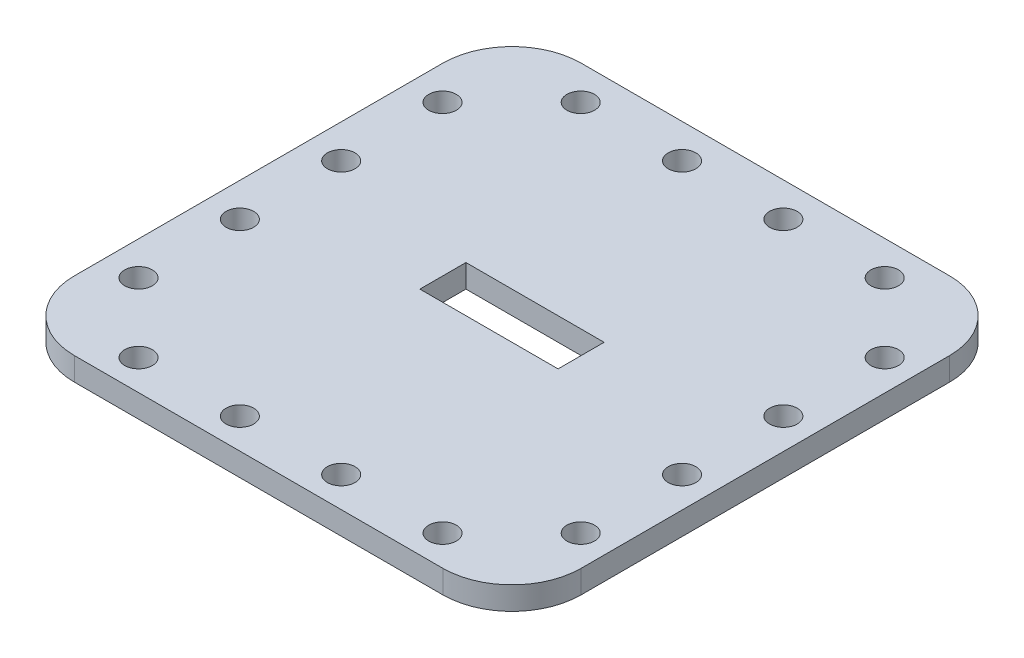
ISO-10303-21;
HEADER;
FILE_DESCRIPTION(('STEP AP214'),'2;1');
FILE_NAME('part.step','',(''),(''),'','','');
FILE_SCHEMA(('AUTOMOTIVE_DESIGN { 1 0 10303 214 1 1 1 1 }'));
ENDSEC;
DATA;
#1=APPLICATION_CONTEXT('core data for automotive mechanical design processes');
#2=APPLICATION_PROTOCOL_DEFINITION('international standard','automotive_design',2000,#1);
#3=PRODUCT_CONTEXT('',#1,'mechanical');
#4=PRODUCT('Part','Part','',(#3));
#5=PRODUCT_RELATED_PRODUCT_CATEGORY('part','',(#4));
#6=PRODUCT_DEFINITION_FORMATION('','',#4);
#7=PRODUCT_DEFINITION_CONTEXT('part definition',#1,'design');
#8=PRODUCT_DEFINITION('design','',#6,#7);
#9=PRODUCT_DEFINITION_SHAPE('','',#8);
#10=(LENGTH_UNIT() NAMED_UNIT(*) SI_UNIT(.MILLI.,.METRE.));
#11=(NAMED_UNIT(*) PLANE_ANGLE_UNIT() SI_UNIT($,.RADIAN.));
#12=(NAMED_UNIT(*) SI_UNIT($,.STERADIAN.) SOLID_ANGLE_UNIT());
#13=UNCERTAINTY_MEASURE_WITH_UNIT(LENGTH_MEASURE(1.E-05),#10,'distance_accuracy_value','');
#14=(GEOMETRIC_REPRESENTATION_CONTEXT(3) GLOBAL_UNCERTAINTY_ASSIGNED_CONTEXT((#13)) GLOBAL_UNIT_ASSIGNED_CONTEXT((#10,
#11,#12)) REPRESENTATION_CONTEXT('',''));
#15=CARTESIAN_POINT('',(0.,0.,0.));
#16=DIRECTION('',(0.,0.,1.));
#17=DIRECTION('',(1.,0.,0.));
#18=AXIS2_PLACEMENT_3D('',#15,#16,#17);
#19=CARTESIAN_POINT('',(40.,5.,55.));
#20=DIRECTION('',(0.,1.,0.));
#21=DIRECTION('',(0.,0.,1.));
#22=AXIS2_PLACEMENT_3D('',#19,#20,#21);
#23=PLANE('',#22);
#24=DIRECTION('',(0.,0.,-1.));
#25=VECTOR('',#24,1.);
#26=CARTESIAN_POINT('',(15.,5.,5.));
#27=LINE('',#26,#25);
#28=CARTESIAN_POINT('',(15.,5.,5.));
#29=VERTEX_POINT('',#28);
#30=CARTESIAN_POINT('',(15.,5.,-5.));
#31=VERTEX_POINT('',#30);
#32=EDGE_CURVE('E56',#29,#31,#27,.T.);
#33=ORIENTED_EDGE('',*,*,#32,.F.);
#34=DIRECTION('',(1.,0.,0.));
#35=VECTOR('',#34,1.);
#36=CARTESIAN_POINT('',(-15.,5.,5.));
#37=LINE('',#36,#35);
#38=CARTESIAN_POINT('',(-15.,5.,5.));
#39=VERTEX_POINT('',#38);
#40=EDGE_CURVE('E147',#39,#29,#37,.T.);
#41=ORIENTED_EDGE('',*,*,#40,.F.);
#42=DIRECTION('',(0.,0.,1.));
#43=VECTOR('',#42,1.);
#44=CARTESIAN_POINT('',(-15.,5.,5.));
#45=LINE('',#44,#43);
#46=CARTESIAN_POINT('',(-15.,5.,-5.));
#47=VERTEX_POINT('',#46);
#48=EDGE_CURVE('E132',#47,#39,#45,.T.);
#49=ORIENTED_EDGE('',*,*,#48,.F.);
#50=DIRECTION('',(-1.,0.,0.));
#51=VECTOR('',#50,1.);
#52=CARTESIAN_POINT('',(-15.,5.,-5.));
#53=LINE('',#52,#51);
#54=EDGE_CURVE('E141',#31,#47,#53,.T.);
#55=ORIENTED_EDGE('',*,*,#54,.F.);
#56=EDGE_LOOP('',(#33,#41,#49,#55));
#57=FACE_BOUND('',#56,.T.);
#58=CARTESIAN_POINT('',(48.3346963055934,5.,-10.5816296180082));
#59=DIRECTION('',(0.,-1.,0.));
#60=DIRECTION('',(0.,0.,-1.));
#61=AXIS2_PLACEMENT_3D('',#58,#59,#60);
#62=CIRCLE('',#61,3.00000000000002);
#63=CARTESIAN_POINT('',(48.3346963055934,5.,-13.5816296180082));
#64=VERTEX_POINT('',#63);
#65=EDGE_CURVE('E210',#64,#64,#62,.T.);
#66=ORIENTED_EDGE('',*,*,#65,.T.);
#67=EDGE_LOOP('',(#66));
#68=FACE_BOUND('',#67,.T.);
#69=CARTESIAN_POINT('',(-32.6653036944065,5.,-47.5816296180083));
#70=DIRECTION('',(0.,-1.,0.));
#71=DIRECTION('',(0.,0.,-1.));
#72=AXIS2_PLACEMENT_3D('',#69,#70,#71);
#73=CIRCLE('',#72,3.00000000000001);
#74=CARTESIAN_POINT('',(-32.6653036944065,5.,-50.5816296180083));
#75=VERTEX_POINT('',#74);
#76=EDGE_CURVE('E222',#75,#75,#73,.T.);
#77=ORIENTED_EDGE('',*,*,#76,.T.);
#78=EDGE_LOOP('',(#77));
#79=FACE_BOUND('',#78,.T.);
#80=CARTESIAN_POINT('',(-47.6653036944066,5.,-32.5816296180082));
#81=DIRECTION('',(0.,-1.,0.));
#82=DIRECTION('',(0.,0.,-1.));
#83=AXIS2_PLACEMENT_3D('',#80,#81,#82);
#84=CIRCLE('',#83,3.);
#85=CARTESIAN_POINT('',(-47.6653036944066,5.,-35.5816296180082));
#86=VERTEX_POINT('',#85);
#87=EDGE_CURVE('E225',#86,#86,#84,.T.);
#88=ORIENTED_EDGE('',*,*,#87,.T.);
#89=EDGE_LOOP('',(#88));
#90=FACE_BOUND('',#89,.T.);
#91=CARTESIAN_POINT('',(-47.6653036944066,5.,-10.5816296180082));
#92=DIRECTION('',(0.,-1.,0.));
#93=DIRECTION('',(0.,0.,-1.));
#94=AXIS2_PLACEMENT_3D('',#91,#92,#93);
#95=CIRCLE('',#94,3.00000000000003);
#96=CARTESIAN_POINT('',(-47.6653036944066,5.,-13.5816296180083));
#97=VERTEX_POINT('',#96);
#98=EDGE_CURVE('E228',#97,#97,#95,.T.);
#99=ORIENTED_EDGE('',*,*,#98,.T.);
#100=EDGE_LOOP('',(#99));
#101=FACE_BOUND('',#100,.T.);
#102=CARTESIAN_POINT('',(-47.6653036944066,5.,11.4183703819918));
#103=DIRECTION('',(0.,-1.,0.));
#104=DIRECTION('',(0.,0.,-1.));
#105=AXIS2_PLACEMENT_3D('',#102,#103,#104);
#106=CIRCLE('',#105,2.99999999999997);
#107=CARTESIAN_POINT('',(-47.6653036944066,5.,8.4183703819918));
#108=VERTEX_POINT('',#107);
#109=EDGE_CURVE('E231',#108,#108,#106,.T.);
#110=ORIENTED_EDGE('',*,*,#109,.T.);
#111=EDGE_LOOP('',(#110));
#112=FACE_BOUND('',#111,.T.);
#113=CARTESIAN_POINT('',(-10.6653036944066,5.,48.4183703819918));
#114=DIRECTION('',(0.,-1.,0.));
#115=DIRECTION('',(0.,0.,-1.));
#116=AXIS2_PLACEMENT_3D('',#113,#114,#115);
#117=CIRCLE('',#116,3.00000000000002);
#118=CARTESIAN_POINT('',(-10.6653036944066,5.,45.4183703819917));
#119=VERTEX_POINT('',#118);
#120=EDGE_CURVE('E234',#119,#119,#117,.T.);
#121=ORIENTED_EDGE('',*,*,#120,.T.);
#122=EDGE_LOOP('',(#121));
#123=FACE_BOUND('',#122,.T.);
#124=CARTESIAN_POINT('',(11.3346963055934,5.,48.4183703819918));
#125=DIRECTION('',(0.,-1.,0.));
#126=DIRECTION('',(0.,0.,-1.));
#127=AXIS2_PLACEMENT_3D('',#124,#125,#126);
#128=CIRCLE('',#127,2.99999999999997);
#129=CARTESIAN_POINT('',(11.3346963055934,5.,45.4183703819918));
#130=VERTEX_POINT('',#129);
#131=EDGE_CURVE('E237',#130,#130,#128,.T.);
#132=ORIENTED_EDGE('',*,*,#131,.T.);
#133=EDGE_LOOP('',(#132));
#134=FACE_BOUND('',#133,.T.);
#135=CARTESIAN_POINT('',(33.3346963055934,5.,48.4183703819918));
#136=DIRECTION('',(0.,-1.,0.));
#137=DIRECTION('',(0.,0.,-1.));
#138=AXIS2_PLACEMENT_3D('',#135,#136,#137);
#139=CIRCLE('',#138,3.00000000000001);
#140=CARTESIAN_POINT('',(33.3346963055934,5.,45.4183703819917));
#141=VERTEX_POINT('',#140);
#142=EDGE_CURVE('E240',#141,#141,#139,.T.);
#143=ORIENTED_EDGE('',*,*,#142,.T.);
#144=EDGE_LOOP('',(#143));
#145=FACE_BOUND('',#144,.T.);
#146=CARTESIAN_POINT('',(48.3346963055934,5.,11.4183703819918));
#147=DIRECTION('',(0.,-1.,0.));
#148=DIRECTION('',(0.,0.,-1.));
#149=AXIS2_PLACEMENT_3D('',#146,#147,#148);
#150=CIRCLE('',#149,2.99999999999997);
#151=CARTESIAN_POINT('',(48.3346963055934,5.,8.4183703819918));
#152=VERTEX_POINT('',#151);
#153=EDGE_CURVE('E243',#152,#152,#150,.T.);
#154=ORIENTED_EDGE('',*,*,#153,.T.);
#155=EDGE_LOOP('',(#154));
#156=FACE_BOUND('',#155,.T.);
#157=CARTESIAN_POINT('',(48.3346963055935,5.,-32.5816296180082));
#158=DIRECTION('',(0.,-1.,0.));
#159=DIRECTION('',(0.,0.,-1.));
#160=AXIS2_PLACEMENT_3D('',#157,#158,#159);
#161=CIRCLE('',#160,3.00000000000001);
#162=CARTESIAN_POINT('',(48.3346963055935,5.,-35.5816296180082));
#163=VERTEX_POINT('',#162);
#164=EDGE_CURVE('E246',#163,#163,#161,.T.);
#165=ORIENTED_EDGE('',*,*,#164,.T.);
#166=EDGE_LOOP('',(#165));
#167=FACE_BOUND('',#166,.T.);
#168=CARTESIAN_POINT('',(33.3346963055935,5.,-47.5816296180082));
#169=DIRECTION('',(0.,-1.,0.));
#170=DIRECTION('',(0.,0.,-1.));
#171=AXIS2_PLACEMENT_3D('',#168,#169,#170);
#172=CIRCLE('',#171,2.99999999999997);
#173=CARTESIAN_POINT('',(33.3346963055935,5.,-50.5816296180082));
#174=VERTEX_POINT('',#173);
#175=EDGE_CURVE('E249',#174,#174,#172,.T.);
#176=ORIENTED_EDGE('',*,*,#175,.T.);
#177=EDGE_LOOP('',(#176));
#178=FACE_BOUND('',#177,.T.);
#179=CARTESIAN_POINT('',(11.3346963055935,5.,-47.5816296180082));
#180=DIRECTION('',(0.,-1.,0.));
#181=DIRECTION('',(0.,0.,-1.));
#182=AXIS2_PLACEMENT_3D('',#179,#180,#181);
#183=CIRCLE('',#182,2.99999999999997);
#184=CARTESIAN_POINT('',(11.3346963055935,5.,-50.5816296180082));
#185=VERTEX_POINT('',#184);
#186=EDGE_CURVE('E252',#185,#185,#183,.T.);
#187=ORIENTED_EDGE('',*,*,#186,.T.);
#188=EDGE_LOOP('',(#187));
#189=FACE_BOUND('',#188,.T.);
#190=CARTESIAN_POINT('',(-10.6653036944065,5.,-47.5816296180082));
#191=DIRECTION('',(0.,-1.,0.));
#192=DIRECTION('',(0.,0.,-1.));
#193=AXIS2_PLACEMENT_3D('',#190,#191,#192);
#194=CIRCLE('',#193,3.00000000000002);
#195=CARTESIAN_POINT('',(-10.6653036944065,5.,-50.5816296180083));
#196=VERTEX_POINT('',#195);
#197=EDGE_CURVE('E255',#196,#196,#194,.T.);
#198=ORIENTED_EDGE('',*,*,#197,.T.);
#199=EDGE_LOOP('',(#198));
#200=FACE_BOUND('',#199,.T.);
#201=CARTESIAN_POINT('',(-47.6653036944065,5.,33.4183703819918));
#202=DIRECTION('',(0.,-1.,0.));
#203=DIRECTION('',(0.,0.,-1.));
#204=AXIS2_PLACEMENT_3D('',#201,#202,#203);
#205=CIRCLE('',#204,3.);
#206=CARTESIAN_POINT('',(-47.6653036944065,5.,30.4183703819918));
#207=VERTEX_POINT('',#206);
#208=EDGE_CURVE('E258',#207,#207,#205,.T.);
#209=ORIENTED_EDGE('',*,*,#208,.T.);
#210=EDGE_LOOP('',(#209));
#211=FACE_BOUND('',#210,.T.);
#212=CARTESIAN_POINT('',(-32.6653036944065,5.,48.4183703819918));
#213=DIRECTION('',(0.,-1.,0.));
#214=DIRECTION('',(0.,0.,-1.));
#215=AXIS2_PLACEMENT_3D('',#212,#213,#214);
#216=CIRCLE('',#215,3.00000000000001);
#217=CARTESIAN_POINT('',(-32.6653036944065,5.,45.4183703819918));
#218=VERTEX_POINT('',#217);
#219=EDGE_CURVE('E261',#218,#218,#216,.T.);
#220=ORIENTED_EDGE('',*,*,#219,.T.);
#221=EDGE_LOOP('',(#220));
#222=FACE_BOUND('',#221,.T.);
#223=CARTESIAN_POINT('',(48.3346963055934,5.,33.4183703819918));
#224=DIRECTION('',(0.,-1.,0.));
#225=DIRECTION('',(0.,0.,-1.));
#226=AXIS2_PLACEMENT_3D('',#223,#224,#225);
#227=CIRCLE('',#226,3.00000000000001);
#228=CARTESIAN_POINT('',(48.3346963055934,5.,30.4183703819918));
#229=VERTEX_POINT('',#228);
#230=EDGE_CURVE('E264',#229,#229,#227,.T.);
#231=ORIENTED_EDGE('',*,*,#230,.T.);
#232=EDGE_LOOP('',(#231));
#233=FACE_BOUND('',#232,.T.);
#234=DIRECTION('',(1.,0.,0.));
#235=VECTOR('',#234,1.);
#236=CARTESIAN_POINT('',(-55.,5.,55.));
#237=LINE('',#236,#235);
#238=CARTESIAN_POINT('',(-40.,5.,55.));
#239=VERTEX_POINT('',#238);
#240=CARTESIAN_POINT('',(40.,5.,55.));
#241=VERTEX_POINT('',#240);
#242=EDGE_CURVE('E197',#239,#241,#237,.T.);
#243=ORIENTED_EDGE('',*,*,#242,.T.);
#244=CARTESIAN_POINT('',(40.,5.,40.));
#245=DIRECTION('',(0.,-1.,0.));
#246=DIRECTION('',(0.,0.,-1.));
#247=AXIS2_PLACEMENT_3D('',#244,#245,#246);
#248=CIRCLE('',#247,15.);
#249=CARTESIAN_POINT('',(55.,5.,40.));
#250=VERTEX_POINT('',#249);
#251=EDGE_CURVE('E154',#241,#250,#248,.F.);
#252=ORIENTED_EDGE('',*,*,#251,.T.);
#253=DIRECTION('',(0.,0.,-1.));
#254=VECTOR('',#253,1.);
#255=CARTESIAN_POINT('',(55.,5.,55.));
#256=LINE('',#255,#254);
#257=CARTESIAN_POINT('',(55.,5.,-40.));
#258=VERTEX_POINT('',#257);
#259=EDGE_CURVE('E202',#250,#258,#256,.T.);
#260=ORIENTED_EDGE('',*,*,#259,.T.);
#261=CARTESIAN_POINT('',(40.,5.,-40.));
#262=DIRECTION('',(0.,-1.,0.));
#263=DIRECTION('',(0.,0.,-1.));
#264=AXIS2_PLACEMENT_3D('',#261,#262,#263);
#265=CIRCLE('',#264,15.);
#266=CARTESIAN_POINT('',(40.,5.,-55.));
#267=VERTEX_POINT('',#266);
#268=EDGE_CURVE('E186',#258,#267,#265,.F.);
#269=ORIENTED_EDGE('',*,*,#268,.T.);
#270=DIRECTION('',(-1.,0.,0.));
#271=VECTOR('',#270,1.);
#272=CARTESIAN_POINT('',(-55.,5.,-55.));
#273=LINE('',#272,#271);
#274=CARTESIAN_POINT('',(-40.,5.,-55.));
#275=VERTEX_POINT('',#274);
#276=EDGE_CURVE('E216',#267,#275,#273,.T.);
#277=ORIENTED_EDGE('',*,*,#276,.T.);
#278=CARTESIAN_POINT('',(-40.,5.,-40.));
#279=DIRECTION('',(0.,-1.,0.));
#280=DIRECTION('',(0.,0.,-1.));
#281=AXIS2_PLACEMENT_3D('',#278,#279,#280);
#282=CIRCLE('',#281,15.);
#283=CARTESIAN_POINT('',(-55.,5.,-40.));
#284=VERTEX_POINT('',#283);
#285=EDGE_CURVE('E176',#275,#284,#282,.F.);
#286=ORIENTED_EDGE('',*,*,#285,.T.);
#287=DIRECTION('',(0.,0.,1.));
#288=VECTOR('',#287,1.);
#289=CARTESIAN_POINT('',(-55.,5.,55.));
#290=LINE('',#289,#288);
#291=CARTESIAN_POINT('',(-55.,5.,40.));
#292=VERTEX_POINT('',#291);
#293=EDGE_CURVE('E213',#284,#292,#290,.T.);
#294=ORIENTED_EDGE('',*,*,#293,.T.);
#295=CARTESIAN_POINT('',(-40.,5.,40.));
#296=DIRECTION('',(0.,-1.,0.));
#297=DIRECTION('',(0.,0.,-1.));
#298=AXIS2_PLACEMENT_3D('',#295,#296,#297);
#299=CIRCLE('',#298,15.);
#300=EDGE_CURVE('E166',#292,#239,#299,.F.);
#301=ORIENTED_EDGE('',*,*,#300,.T.);
#302=EDGE_LOOP('',(#243,#252,#260,#269,#277,#286,#294,#301));
#303=FACE_BOUND('',#302,.T.);
#304=ADVANCED_FACE('F42',(#57,#68,#79,#90,#101,#112,#123,#134,#145,#156,#167,#178,#189,#200,
#211,#222,#233,#303),#23,.T.);
#305=CARTESIAN_POINT('',(40.,5.,-40.));
#306=DIRECTION('',(0.,1.,0.));
#307=DIRECTION('',(0.,0.,1.));
#308=AXIS2_PLACEMENT_3D('',#305,#306,#307);
#309=CYLINDRICAL_SURFACE('',#308,15.);
#310=DIRECTION('',(0.,1.,0.));
#311=VECTOR('',#310,1.);
#312=CARTESIAN_POINT('',(55.,5.,-40.));
#313=LINE('',#312,#311);
#314=CARTESIAN_POINT('',(55.,0.,-40.));
#315=VERTEX_POINT('',#314);
#316=EDGE_CURVE('E194',#315,#258,#313,.T.);
#317=ORIENTED_EDGE('',*,*,#316,.F.);
#318=CARTESIAN_POINT('',(40.,0.,-40.));
#319=DIRECTION('',(0.,-1.,0.));
#320=DIRECTION('',(0.,0.,-1.));
#321=AXIS2_PLACEMENT_3D('',#318,#319,#320);
#322=CIRCLE('',#321,15.);
#323=CARTESIAN_POINT('',(40.,0.,-55.));
#324=VERTEX_POINT('',#323);
#325=EDGE_CURVE('E188',#324,#315,#322,.T.);
#326=ORIENTED_EDGE('',*,*,#325,.F.);
#327=DIRECTION('',(0.,1.,0.));
#328=VECTOR('',#327,1.);
#329=CARTESIAN_POINT('',(40.,5.,-55.));
#330=LINE('',#329,#328);
#331=EDGE_CURVE('E191',#267,#324,#330,.F.);
#332=ORIENTED_EDGE('',*,*,#331,.F.);
#333=ORIENTED_EDGE('',*,*,#268,.F.);
#334=EDGE_LOOP('',(#317,#326,#332,#333));
#335=FACE_BOUND('',#334,.T.);
#336=ADVANCED_FACE('F340',(#335),#309,.T.);
#337=CARTESIAN_POINT('',(-40.,5.,-40.));
#338=DIRECTION('',(0.,1.,0.));
#339=DIRECTION('',(0.,0.,1.));
#340=AXIS2_PLACEMENT_3D('',#337,#338,#339);
#341=CYLINDRICAL_SURFACE('',#340,15.);
#342=DIRECTION('',(0.,1.,0.));
#343=VECTOR('',#342,1.);
#344=CARTESIAN_POINT('',(-40.,5.,-55.));
#345=LINE('',#344,#343);
#346=CARTESIAN_POINT('',(-40.,0.,-55.));
#347=VERTEX_POINT('',#346);
#348=EDGE_CURVE('E183',#347,#275,#345,.T.);
#349=ORIENTED_EDGE('',*,*,#348,.F.);
#350=CARTESIAN_POINT('',(-40.,0.,-40.));
#351=DIRECTION('',(0.,-1.,0.));
#352=DIRECTION('',(0.,0.,-1.));
#353=AXIS2_PLACEMENT_3D('',#350,#351,#352);
#354=CIRCLE('',#353,15.);
#355=CARTESIAN_POINT('',(-55.,0.,-40.));
#356=VERTEX_POINT('',#355);
#357=EDGE_CURVE('E178',#356,#347,#354,.T.);
#358=ORIENTED_EDGE('',*,*,#357,.F.);
#359=DIRECTION('',(0.,1.,0.));
#360=VECTOR('',#359,1.);
#361=CARTESIAN_POINT('',(-55.,5.,-40.));
#362=LINE('',#361,#360);
#363=EDGE_CURVE('E180',#284,#356,#362,.F.);
#364=ORIENTED_EDGE('',*,*,#363,.F.);
#365=ORIENTED_EDGE('',*,*,#285,.F.);
#366=EDGE_LOOP('',(#349,#358,#364,#365));
#367=FACE_BOUND('',#366,.T.);
#368=ADVANCED_FACE('F342',(#367),#341,.T.);
#369=CARTESIAN_POINT('',(-40.,5.,40.));
#370=DIRECTION('',(0.,1.,0.));
#371=DIRECTION('',(0.,0.,1.));
#372=AXIS2_PLACEMENT_3D('',#369,#370,#371);
#373=CYLINDRICAL_SURFACE('',#372,15.);
#374=DIRECTION('',(0.,1.,0.));
#375=VECTOR('',#374,1.);
#376=CARTESIAN_POINT('',(-55.,5.,40.));
#377=LINE('',#376,#375);
#378=CARTESIAN_POINT('',(-55.,0.,40.));
#379=VERTEX_POINT('',#378);
#380=EDGE_CURVE('E173',#379,#292,#377,.T.);
#381=ORIENTED_EDGE('',*,*,#380,.F.);
#382=CARTESIAN_POINT('',(-40.,0.,40.));
#383=DIRECTION('',(0.,-1.,0.));
#384=DIRECTION('',(0.,0.,-1.));
#385=AXIS2_PLACEMENT_3D('',#382,#383,#384);
#386=CIRCLE('',#385,15.);
#387=CARTESIAN_POINT('',(-40.,0.,55.));
#388=VERTEX_POINT('',#387);
#389=EDGE_CURVE('E168',#388,#379,#386,.T.);
#390=ORIENTED_EDGE('',*,*,#389,.F.);
#391=DIRECTION('',(0.,1.,0.));
#392=VECTOR('',#391,1.);
#393=CARTESIAN_POINT('',(-40.,5.,55.));
#394=LINE('',#393,#392);
#395=EDGE_CURVE('E170',#239,#388,#394,.F.);
#396=ORIENTED_EDGE('',*,*,#395,.F.);
#397=ORIENTED_EDGE('',*,*,#300,.F.);
#398=EDGE_LOOP('',(#381,#390,#396,#397));
#399=FACE_BOUND('',#398,.T.);
#400=ADVANCED_FACE('F348',(#399),#373,.T.);
#401=CARTESIAN_POINT('',(40.,5.,40.));
#402=DIRECTION('',(0.,1.,0.));
#403=DIRECTION('',(0.,0.,1.));
#404=AXIS2_PLACEMENT_3D('',#401,#402,#403);
#405=CYLINDRICAL_SURFACE('',#404,15.);
#406=DIRECTION('',(0.,1.,0.));
#407=VECTOR('',#406,1.);
#408=CARTESIAN_POINT('',(40.,5.,55.));
#409=LINE('',#408,#407);
#410=CARTESIAN_POINT('',(40.,0.,55.));
#411=VERTEX_POINT('',#410);
#412=EDGE_CURVE('E163',#411,#241,#409,.T.);
#413=ORIENTED_EDGE('',*,*,#412,.F.);
#414=CARTESIAN_POINT('',(40.,0.,40.));
#415=DIRECTION('',(0.,-1.,0.));
#416=DIRECTION('',(0.,0.,-1.));
#417=AXIS2_PLACEMENT_3D('',#414,#415,#416);
#418=CIRCLE('',#417,15.);
#419=CARTESIAN_POINT('',(55.,0.,40.));
#420=VERTEX_POINT('',#419);
#421=EDGE_CURVE('E158',#420,#411,#418,.T.);
#422=ORIENTED_EDGE('',*,*,#421,.F.);
#423=DIRECTION('',(0.,1.,0.));
#424=VECTOR('',#423,1.);
#425=CARTESIAN_POINT('',(55.,5.,40.));
#426=LINE('',#425,#424);
#427=EDGE_CURVE('E160',#250,#420,#426,.F.);
#428=ORIENTED_EDGE('',*,*,#427,.F.);
#429=ORIENTED_EDGE('',*,*,#251,.F.);
#430=EDGE_LOOP('',(#413,#422,#428,#429));
#431=FACE_BOUND('',#430,.T.);
#432=ADVANCED_FACE('F369',(#431),#405,.T.);
#433=CARTESIAN_POINT('',(0.,0.,0.));
#434=DIRECTION('',(0.,-1.,0.));
#435=DIRECTION('',(0.,0.,-1.));
#436=AXIS2_PLACEMENT_3D('',#433,#434,#435);
#437=PLANE('',#436);
#438=DIRECTION('',(0.,0.,1.));
#439=VECTOR('',#438,1.);
#440=CARTESIAN_POINT('',(15.,0.,0.));
#441=LINE('',#440,#439);
#442=CARTESIAN_POINT('',(15.,0.,-5.));
#443=VERTEX_POINT('',#442);
#444=CARTESIAN_POINT('',(15.,0.,5.));
#445=VERTEX_POINT('',#444);
#446=EDGE_CURVE('E11',#443,#445,#441,.T.);
#447=ORIENTED_EDGE('',*,*,#446,.F.);
#448=DIRECTION('',(1.,0.,0.));
#449=VECTOR('',#448,1.);
#450=CARTESIAN_POINT('',(0.,0.,-5.));
#451=LINE('',#450,#449);
#452=CARTESIAN_POINT('',(-15.,0.,-5.));
#453=VERTEX_POINT('',#452);
#454=EDGE_CURVE('E298',#453,#443,#451,.T.);
#455=ORIENTED_EDGE('',*,*,#454,.F.);
#456=DIRECTION('',(0.,0.,-1.));
#457=VECTOR('',#456,1.);
#458=CARTESIAN_POINT('',(-15.,0.,0.));
#459=LINE('',#458,#457);
#460=CARTESIAN_POINT('',(-15.,0.,5.));
#461=VERTEX_POINT('',#460);
#462=EDGE_CURVE('E135',#461,#453,#459,.T.);
#463=ORIENTED_EDGE('',*,*,#462,.F.);
#464=DIRECTION('',(-1.,0.,0.));
#465=VECTOR('',#464,1.);
#466=CARTESIAN_POINT('',(0.,0.,5.));
#467=LINE('',#466,#465);
#468=EDGE_CURVE('E49',#445,#461,#467,.T.);
#469=ORIENTED_EDGE('',*,*,#468,.F.);
#470=EDGE_LOOP('',(#447,#455,#463,#469));
#471=FACE_BOUND('',#470,.T.);
#472=CARTESIAN_POINT('',(48.3346963055934,0.,-10.5816296180082));
#473=DIRECTION('',(0.,-1.,0.));
#474=DIRECTION('',(0.,0.,-1.));
#475=AXIS2_PLACEMENT_3D('',#472,#473,#474);
#476=CIRCLE('',#475,3.00000000000002);
#477=CARTESIAN_POINT('',(48.3346963055934,0.,-13.5816296180082));
#478=VERTEX_POINT('',#477);
#479=EDGE_CURVE('E270',#478,#478,#476,.T.);
#480=ORIENTED_EDGE('',*,*,#479,.F.);
#481=EDGE_LOOP('',(#480));
#482=FACE_BOUND('',#481,.T.);
#483=CARTESIAN_POINT('',(-32.6653036944065,0.,-47.5816296180083));
#484=DIRECTION('',(0.,-1.,0.));
#485=DIRECTION('',(0.,0.,-1.));
#486=AXIS2_PLACEMENT_3D('',#483,#484,#485);
#487=CIRCLE('',#486,3.00000000000001);
#488=CARTESIAN_POINT('',(-32.6653036944065,0.,-50.5816296180083));
#489=VERTEX_POINT('',#488);
#490=EDGE_CURVE('E290',#489,#489,#487,.T.);
#491=ORIENTED_EDGE('',*,*,#490,.F.);
#492=EDGE_LOOP('',(#491));
#493=FACE_BOUND('',#492,.T.);
#494=CARTESIAN_POINT('',(-47.6653036944066,0.,-32.5816296180082));
#495=DIRECTION('',(0.,-1.,0.));
#496=DIRECTION('',(0.,0.,-1.));
#497=AXIS2_PLACEMENT_3D('',#494,#495,#496);
#498=CIRCLE('',#497,3.);
#499=CARTESIAN_POINT('',(-47.6653036944066,0.,-35.5816296180082));
#500=VERTEX_POINT('',#499);
#501=EDGE_CURVE('E287',#500,#500,#498,.T.);
#502=ORIENTED_EDGE('',*,*,#501,.F.);
#503=EDGE_LOOP('',(#502));
#504=FACE_BOUND('',#503,.T.);
#505=CARTESIAN_POINT('',(-47.6653036944066,0.,-10.5816296180082));
#506=DIRECTION('',(0.,-1.,0.));
#507=DIRECTION('',(0.,0.,-1.));
#508=AXIS2_PLACEMENT_3D('',#505,#506,#507);
#509=CIRCLE('',#508,3.00000000000003);
#510=CARTESIAN_POINT('',(-47.6653036944066,0.,-13.5816296180083));
#511=VERTEX_POINT('',#510);
#512=EDGE_CURVE('E284',#511,#511,#509,.T.);
#513=ORIENTED_EDGE('',*,*,#512,.F.);
#514=EDGE_LOOP('',(#513));
#515=FACE_BOUND('',#514,.T.);
#516=CARTESIAN_POINT('',(-47.6653036944066,0.,11.4183703819918));
#517=DIRECTION('',(0.,-1.,0.));
#518=DIRECTION('',(0.,0.,-1.));
#519=AXIS2_PLACEMENT_3D('',#516,#517,#518);
#520=CIRCLE('',#519,2.99999999999997);
#521=CARTESIAN_POINT('',(-47.6653036944066,0.,8.4183703819918));
#522=VERTEX_POINT('',#521);
#523=EDGE_CURVE('E281',#522,#522,#520,.T.);
#524=ORIENTED_EDGE('',*,*,#523,.F.);
#525=EDGE_LOOP('',(#524));
#526=FACE_BOUND('',#525,.T.);
#527=CARTESIAN_POINT('',(-10.6653036944066,0.,48.4183703819918));
#528=DIRECTION('',(0.,-1.,0.));
#529=DIRECTION('',(0.,0.,-1.));
#530=AXIS2_PLACEMENT_3D('',#527,#528,#529);
#531=CIRCLE('',#530,3.00000000000002);
#532=CARTESIAN_POINT('',(-10.6653036944066,0.,45.4183703819917));
#533=VERTEX_POINT('',#532);
#534=EDGE_CURVE('E278',#533,#533,#531,.T.);
#535=ORIENTED_EDGE('',*,*,#534,.F.);
#536=EDGE_LOOP('',(#535));
#537=FACE_BOUND('',#536,.T.);
#538=CARTESIAN_POINT('',(11.3346963055934,0.,48.4183703819918));
#539=DIRECTION('',(0.,-1.,0.));
#540=DIRECTION('',(0.,0.,-1.));
#541=AXIS2_PLACEMENT_3D('',#538,#539,#540);
#542=CIRCLE('',#541,2.99999999999997);
#543=CARTESIAN_POINT('',(11.3346963055934,0.,45.4183703819918));
#544=VERTEX_POINT('',#543);
#545=EDGE_CURVE('E275',#544,#544,#542,.T.);
#546=ORIENTED_EDGE('',*,*,#545,.F.);
#547=EDGE_LOOP('',(#546));
#548=FACE_BOUND('',#547,.T.);
#549=CARTESIAN_POINT('',(33.3346963055934,0.,48.4183703819918));
#550=DIRECTION('',(0.,-1.,0.));
#551=DIRECTION('',(0.,0.,-1.));
#552=AXIS2_PLACEMENT_3D('',#549,#550,#551);
#553=CIRCLE('',#552,3.00000000000001);
#554=CARTESIAN_POINT('',(33.3346963055934,0.,45.4183703819917));
#555=VERTEX_POINT('',#554);
#556=EDGE_CURVE('E271',#555,#555,#553,.T.);
#557=ORIENTED_EDGE('',*,*,#556,.F.);
#558=EDGE_LOOP('',(#557));
#559=FACE_BOUND('',#558,.T.);
#560=CARTESIAN_POINT('',(48.3346963055934,0.,11.4183703819918));
#561=DIRECTION('',(0.,-1.,0.));
#562=DIRECTION('',(0.,0.,-1.));
#563=AXIS2_PLACEMENT_3D('',#560,#561,#562);
#564=CIRCLE('',#563,2.99999999999997);
#565=CARTESIAN_POINT('',(48.3346963055934,0.,8.4183703819918));
#566=VERTEX_POINT('',#565);
#567=EDGE_CURVE('E274',#566,#566,#564,.T.);
#568=ORIENTED_EDGE('',*,*,#567,.F.);
#569=EDGE_LOOP('',(#568));
#570=FACE_BOUND('',#569,.T.);
#571=CARTESIAN_POINT('',(48.3346963055935,0.,-32.5816296180082));
#572=DIRECTION('',(0.,-1.,0.));
#573=DIRECTION('',(0.,0.,-1.));
#574=AXIS2_PLACEMENT_3D('',#571,#572,#573);
#575=CIRCLE('',#574,3.00000000000001);
#576=CARTESIAN_POINT('',(48.3346963055935,0.,-35.5816296180082));
#577=VERTEX_POINT('',#576);
#578=EDGE_CURVE('E311',#577,#577,#575,.T.);
#579=ORIENTED_EDGE('',*,*,#578,.F.);
#580=EDGE_LOOP('',(#579));
#581=FACE_BOUND('',#580,.T.);
#582=CARTESIAN_POINT('',(33.3346963055935,0.,-47.5816296180082));
#583=DIRECTION('',(0.,-1.,0.));
#584=DIRECTION('',(0.,0.,-1.));
#585=AXIS2_PLACEMENT_3D('',#582,#583,#584);
#586=CIRCLE('',#585,2.99999999999997);
#587=CARTESIAN_POINT('',(33.3346963055935,0.,-50.5816296180082));
#588=VERTEX_POINT('',#587);
#589=EDGE_CURVE('E308',#588,#588,#586,.T.);
#590=ORIENTED_EDGE('',*,*,#589,.F.);
#591=EDGE_LOOP('',(#590));
#592=FACE_BOUND('',#591,.T.);
#593=CARTESIAN_POINT('',(11.3346963055935,0.,-47.5816296180082));
#594=DIRECTION('',(0.,-1.,0.));
#595=DIRECTION('',(0.,0.,-1.));
#596=AXIS2_PLACEMENT_3D('',#593,#594,#595);
#597=CIRCLE('',#596,2.99999999999997);
#598=CARTESIAN_POINT('',(11.3346963055935,0.,-50.5816296180082));
#599=VERTEX_POINT('',#598);
#600=EDGE_CURVE('E305',#599,#599,#597,.T.);
#601=ORIENTED_EDGE('',*,*,#600,.F.);
#602=EDGE_LOOP('',(#601));
#603=FACE_BOUND('',#602,.T.);
#604=CARTESIAN_POINT('',(-10.6653036944065,0.,-47.5816296180082));
#605=DIRECTION('',(0.,-1.,0.));
#606=DIRECTION('',(0.,0.,-1.));
#607=AXIS2_PLACEMENT_3D('',#604,#605,#606);
#608=CIRCLE('',#607,3.00000000000002);
#609=CARTESIAN_POINT('',(-10.6653036944065,0.,-50.5816296180083));
#610=VERTEX_POINT('',#609);
#611=EDGE_CURVE('E302',#610,#610,#608,.T.);
#612=ORIENTED_EDGE('',*,*,#611,.F.);
#613=EDGE_LOOP('',(#612));
#614=FACE_BOUND('',#613,.T.);
#615=CARTESIAN_POINT('',(-47.6653036944065,0.,33.4183703819918));
#616=DIRECTION('',(0.,-1.,0.));
#617=DIRECTION('',(0.,0.,-1.));
#618=AXIS2_PLACEMENT_3D('',#615,#616,#617);
#619=CIRCLE('',#618,3.);
#620=CARTESIAN_POINT('',(-47.6653036944065,0.,30.4183703819918));
#621=VERTEX_POINT('',#620);
#622=EDGE_CURVE('E299',#621,#621,#619,.T.);
#623=ORIENTED_EDGE('',*,*,#622,.F.);
#624=EDGE_LOOP('',(#623));
#625=FACE_BOUND('',#624,.T.);
#626=CARTESIAN_POINT('',(-32.6653036944065,0.,48.4183703819918));
#627=DIRECTION('',(0.,-1.,0.));
#628=DIRECTION('',(0.,0.,-1.));
#629=AXIS2_PLACEMENT_3D('',#626,#627,#628);
#630=CIRCLE('',#629,3.00000000000001);
#631=CARTESIAN_POINT('',(-32.6653036944065,0.,45.4183703819918));
#632=VERTEX_POINT('',#631);
#633=EDGE_CURVE('E295',#632,#632,#630,.T.);
#634=ORIENTED_EDGE('',*,*,#633,.F.);
#635=EDGE_LOOP('',(#634));
#636=FACE_BOUND('',#635,.T.);
#637=CARTESIAN_POINT('',(48.3346963055934,0.,33.4183703819918));
#638=DIRECTION('',(0.,-1.,0.));
#639=DIRECTION('',(0.,0.,-1.));
#640=AXIS2_PLACEMENT_3D('',#637,#638,#639);
#641=CIRCLE('',#640,3.00000000000001);
#642=CARTESIAN_POINT('',(48.3346963055934,0.,30.4183703819918));
#643=VERTEX_POINT('',#642);
#644=EDGE_CURVE('E267',#643,#643,#641,.T.);
#645=ORIENTED_EDGE('',*,*,#644,.F.);
#646=EDGE_LOOP('',(#645));
#647=FACE_BOUND('',#646,.T.);
#648=DIRECTION('',(0.,0.,-1.));
#649=VECTOR('',#648,1.);
#650=CARTESIAN_POINT('',(55.,0.,55.));
#651=LINE('',#650,#649);
#652=EDGE_CURVE('E208',#420,#315,#651,.T.);
#653=ORIENTED_EDGE('',*,*,#652,.F.);
#654=ORIENTED_EDGE('',*,*,#421,.T.);
#655=DIRECTION('',(1.,0.,0.));
#656=VECTOR('',#655,1.);
#657=CARTESIAN_POINT('',(-55.,0.,55.));
#658=LINE('',#657,#656);
#659=EDGE_CURVE('E198',#388,#411,#658,.T.);
#660=ORIENTED_EDGE('',*,*,#659,.F.);
#661=ORIENTED_EDGE('',*,*,#389,.T.);
#662=DIRECTION('',(0.,0.,1.));
#663=VECTOR('',#662,1.);
#664=CARTESIAN_POINT('',(-55.,0.,55.));
#665=LINE('',#664,#663);
#666=EDGE_CURVE('E201',#356,#379,#665,.T.);
#667=ORIENTED_EDGE('',*,*,#666,.F.);
#668=ORIENTED_EDGE('',*,*,#357,.T.);
#669=DIRECTION('',(-1.,0.,0.));
#670=VECTOR('',#669,1.);
#671=CARTESIAN_POINT('',(-55.,0.,-55.));
#672=LINE('',#671,#670);
#673=EDGE_CURVE('E205',#324,#347,#672,.T.);
#674=ORIENTED_EDGE('',*,*,#673,.F.);
#675=ORIENTED_EDGE('',*,*,#325,.T.);
#676=EDGE_LOOP('',(#653,#654,#660,#661,#667,#668,#674,#675));
#677=FACE_BOUND('',#676,.T.);
#678=ADVANCED_FACE('F323',(#471,#482,#493,#504,#515,#526,#537,#548,#559,#570,#581,#592,#603,
#614,#625,#636,#647,#677),#437,.T.);
#679=CARTESIAN_POINT('',(48.3346963055934,10.,-10.5816296180082));
#680=DIRECTION('',(0.,-1.,0.));
#681=DIRECTION('',(0.,0.,-1.));
#682=AXIS2_PLACEMENT_3D('',#679,#680,#681);
#683=CYLINDRICAL_SURFACE('',#682,3.00000000000002);
#684=ORIENTED_EDGE('',*,*,#479,.T.);
#685=EDGE_LOOP('',(#684));
#686=FACE_BOUND('',#685,.T.);
#687=ORIENTED_EDGE('',*,*,#65,.F.);
#688=EDGE_LOOP('',(#687));
#689=FACE_BOUND('',#688,.T.);
#690=ADVANCED_FACE('F368',(#686,#689),#683,.F.);
#691=CARTESIAN_POINT('',(-32.6653036944065,10.,-47.5816296180083));
#692=DIRECTION('',(0.,-1.,0.));
#693=DIRECTION('',(0.,0.,-1.));
#694=AXIS2_PLACEMENT_3D('',#691,#692,#693);
#695=CYLINDRICAL_SURFACE('',#694,3.00000000000001);
#696=ORIENTED_EDGE('',*,*,#490,.T.);
#697=EDGE_LOOP('',(#696));
#698=FACE_BOUND('',#697,.T.);
#699=ORIENTED_EDGE('',*,*,#76,.F.);
#700=EDGE_LOOP('',(#699));
#701=FACE_BOUND('',#700,.T.);
#702=ADVANCED_FACE('F398',(#698,#701),#695,.F.);
#703=CARTESIAN_POINT('',(-47.6653036944066,10.,-32.5816296180082));
#704=DIRECTION('',(0.,-1.,0.));
#705=DIRECTION('',(0.,0.,-1.));
#706=AXIS2_PLACEMENT_3D('',#703,#704,#705);
#707=CYLINDRICAL_SURFACE('',#706,3.);
#708=ORIENTED_EDGE('',*,*,#501,.T.);
#709=EDGE_LOOP('',(#708));
#710=FACE_BOUND('',#709,.T.);
#711=ORIENTED_EDGE('',*,*,#87,.F.);
#712=EDGE_LOOP('',(#711));
#713=FACE_BOUND('',#712,.T.);
#714=ADVANCED_FACE('F394',(#710,#713),#707,.F.);
#715=CARTESIAN_POINT('',(-47.6653036944066,10.,-10.5816296180082));
#716=DIRECTION('',(0.,-1.,0.));
#717=DIRECTION('',(0.,0.,-1.));
#718=AXIS2_PLACEMENT_3D('',#715,#716,#717);
#719=CYLINDRICAL_SURFACE('',#718,3.00000000000003);
#720=ORIENTED_EDGE('',*,*,#512,.T.);
#721=EDGE_LOOP('',(#720));
#722=FACE_BOUND('',#721,.T.);
#723=ORIENTED_EDGE('',*,*,#98,.F.);
#724=EDGE_LOOP('',(#723));
#725=FACE_BOUND('',#724,.T.);
#726=ADVANCED_FACE('F390',(#722,#725),#719,.F.);
#727=CARTESIAN_POINT('',(-47.6653036944066,10.,11.4183703819918));
#728=DIRECTION('',(0.,-1.,0.));
#729=DIRECTION('',(0.,0.,-1.));
#730=AXIS2_PLACEMENT_3D('',#727,#728,#729);
#731=CYLINDRICAL_SURFACE('',#730,2.99999999999997);
#732=ORIENTED_EDGE('',*,*,#523,.T.);
#733=EDGE_LOOP('',(#732));
#734=FACE_BOUND('',#733,.T.);
#735=ORIENTED_EDGE('',*,*,#109,.F.);
#736=EDGE_LOOP('',(#735));
#737=FACE_BOUND('',#736,.T.);
#738=ADVANCED_FACE('F386',(#734,#737),#731,.F.);
#739=CARTESIAN_POINT('',(-10.6653036944066,10.,48.4183703819918));
#740=DIRECTION('',(0.,-1.,0.));
#741=DIRECTION('',(0.,0.,-1.));
#742=AXIS2_PLACEMENT_3D('',#739,#740,#741);
#743=CYLINDRICAL_SURFACE('',#742,3.00000000000002);
#744=ORIENTED_EDGE('',*,*,#534,.T.);
#745=EDGE_LOOP('',(#744));
#746=FACE_BOUND('',#745,.T.);
#747=ORIENTED_EDGE('',*,*,#120,.F.);
#748=EDGE_LOOP('',(#747));
#749=FACE_BOUND('',#748,.T.);
#750=ADVANCED_FACE('F382',(#746,#749),#743,.F.);
#751=CARTESIAN_POINT('',(11.3346963055934,10.,48.4183703819918));
#752=DIRECTION('',(0.,-1.,0.));
#753=DIRECTION('',(0.,0.,-1.));
#754=AXIS2_PLACEMENT_3D('',#751,#752,#753);
#755=CYLINDRICAL_SURFACE('',#754,2.99999999999997);
#756=ORIENTED_EDGE('',*,*,#545,.T.);
#757=EDGE_LOOP('',(#756));
#758=FACE_BOUND('',#757,.T.);
#759=ORIENTED_EDGE('',*,*,#131,.F.);
#760=EDGE_LOOP('',(#759));
#761=FACE_BOUND('',#760,.T.);
#762=ADVANCED_FACE('F378',(#758,#761),#755,.F.);
#763=CARTESIAN_POINT('',(33.3346963055934,10.,48.4183703819918));
#764=DIRECTION('',(0.,-1.,0.));
#765=DIRECTION('',(0.,0.,-1.));
#766=AXIS2_PLACEMENT_3D('',#763,#764,#765);
#767=CYLINDRICAL_SURFACE('',#766,3.00000000000001);
#768=ORIENTED_EDGE('',*,*,#556,.T.);
#769=EDGE_LOOP('',(#768));
#770=FACE_BOUND('',#769,.T.);
#771=ORIENTED_EDGE('',*,*,#142,.F.);
#772=EDGE_LOOP('',(#771));
#773=FACE_BOUND('',#772,.T.);
#774=ADVANCED_FACE('F374',(#770,#773),#767,.F.);
#775=CARTESIAN_POINT('',(48.3346963055934,10.,11.4183703819918));
#776=DIRECTION('',(0.,-1.,0.));
#777=DIRECTION('',(0.,0.,-1.));
#778=AXIS2_PLACEMENT_3D('',#775,#776,#777);
#779=CYLINDRICAL_SURFACE('',#778,2.99999999999997);
#780=ORIENTED_EDGE('',*,*,#567,.T.);
#781=EDGE_LOOP('',(#780));
#782=FACE_BOUND('',#781,.T.);
#783=ORIENTED_EDGE('',*,*,#153,.F.);
#784=EDGE_LOOP('',(#783));
#785=FACE_BOUND('',#784,.T.);
#786=ADVANCED_FACE('F377',(#782,#785),#779,.F.);
#787=CARTESIAN_POINT('',(48.3346963055935,10.,-32.5816296180082));
#788=DIRECTION('',(0.,-1.,0.));
#789=DIRECTION('',(0.,0.,-1.));
#790=AXIS2_PLACEMENT_3D('',#787,#788,#789);
#791=CYLINDRICAL_SURFACE('',#790,3.00000000000001);
#792=ORIENTED_EDGE('',*,*,#578,.T.);
#793=EDGE_LOOP('',(#792));
#794=FACE_BOUND('',#793,.T.);
#795=ORIENTED_EDGE('',*,*,#164,.F.);
#796=EDGE_LOOP('',(#795));
#797=FACE_BOUND('',#796,.T.);
#798=ADVANCED_FACE('F424',(#794,#797),#791,.F.);
#799=CARTESIAN_POINT('',(33.3346963055935,10.,-47.5816296180082));
#800=DIRECTION('',(0.,-1.,0.));
#801=DIRECTION('',(0.,0.,-1.));
#802=AXIS2_PLACEMENT_3D('',#799,#800,#801);
#803=CYLINDRICAL_SURFACE('',#802,2.99999999999997);
#804=ORIENTED_EDGE('',*,*,#589,.T.);
#805=EDGE_LOOP('',(#804));
#806=FACE_BOUND('',#805,.T.);
#807=ORIENTED_EDGE('',*,*,#175,.F.);
#808=EDGE_LOOP('',(#807));
#809=FACE_BOUND('',#808,.T.);
#810=ADVANCED_FACE('F420',(#806,#809),#803,.F.);
#811=CARTESIAN_POINT('',(11.3346963055935,10.,-47.5816296180082));
#812=DIRECTION('',(0.,-1.,0.));
#813=DIRECTION('',(0.,0.,-1.));
#814=AXIS2_PLACEMENT_3D('',#811,#812,#813);
#815=CYLINDRICAL_SURFACE('',#814,2.99999999999997);
#816=ORIENTED_EDGE('',*,*,#600,.T.);
#817=EDGE_LOOP('',(#816));
#818=FACE_BOUND('',#817,.T.);
#819=ORIENTED_EDGE('',*,*,#186,.F.);
#820=EDGE_LOOP('',(#819));
#821=FACE_BOUND('',#820,.T.);
#822=ADVANCED_FACE('F416',(#818,#821),#815,.F.);
#823=CARTESIAN_POINT('',(-10.6653036944065,10.,-47.5816296180082));
#824=DIRECTION('',(0.,-1.,0.));
#825=DIRECTION('',(0.,0.,-1.));
#826=AXIS2_PLACEMENT_3D('',#823,#824,#825);
#827=CYLINDRICAL_SURFACE('',#826,3.00000000000002);
#828=ORIENTED_EDGE('',*,*,#611,.T.);
#829=EDGE_LOOP('',(#828));
#830=FACE_BOUND('',#829,.T.);
#831=ORIENTED_EDGE('',*,*,#197,.F.);
#832=EDGE_LOOP('',(#831));
#833=FACE_BOUND('',#832,.T.);
#834=ADVANCED_FACE('F412',(#830,#833),#827,.F.);
#835=CARTESIAN_POINT('',(-47.6653036944065,10.,33.4183703819918));
#836=DIRECTION('',(0.,-1.,0.));
#837=DIRECTION('',(0.,0.,-1.));
#838=AXIS2_PLACEMENT_3D('',#835,#836,#837);
#839=CYLINDRICAL_SURFACE('',#838,3.);
#840=ORIENTED_EDGE('',*,*,#622,.T.);
#841=EDGE_LOOP('',(#840));
#842=FACE_BOUND('',#841,.T.);
#843=ORIENTED_EDGE('',*,*,#208,.F.);
#844=EDGE_LOOP('',(#843));
#845=FACE_BOUND('',#844,.T.);
#846=ADVANCED_FACE('F408',(#842,#845),#839,.F.);
#847=CARTESIAN_POINT('',(-32.6653036944065,10.,48.4183703819918));
#848=DIRECTION('',(0.,-1.,0.));
#849=DIRECTION('',(0.,0.,-1.));
#850=AXIS2_PLACEMENT_3D('',#847,#848,#849);
#851=CYLINDRICAL_SURFACE('',#850,3.00000000000001);
#852=ORIENTED_EDGE('',*,*,#633,.T.);
#853=EDGE_LOOP('',(#852));
#854=FACE_BOUND('',#853,.T.);
#855=ORIENTED_EDGE('',*,*,#219,.F.);
#856=EDGE_LOOP('',(#855));
#857=FACE_BOUND('',#856,.T.);
#858=ADVANCED_FACE('F372',(#854,#857),#851,.F.);
#859=CARTESIAN_POINT('',(48.3346963055934,10.,33.4183703819918));
#860=DIRECTION('',(0.,-1.,0.));
#861=DIRECTION('',(0.,0.,-1.));
#862=AXIS2_PLACEMENT_3D('',#859,#860,#861);
#863=CYLINDRICAL_SURFACE('',#862,3.00000000000001);
#864=ORIENTED_EDGE('',*,*,#644,.T.);
#865=EDGE_LOOP('',(#864));
#866=FACE_BOUND('',#865,.T.);
#867=ORIENTED_EDGE('',*,*,#230,.F.);
#868=EDGE_LOOP('',(#867));
#869=FACE_BOUND('',#868,.T.);
#870=ADVANCED_FACE('F364',(#866,#869),#863,.F.);
#871=CARTESIAN_POINT('',(-55.,5.,55.));
#872=DIRECTION('',(0.,0.,-1.));
#873=DIRECTION('',(-1.,0.,0.));
#874=AXIS2_PLACEMENT_3D('',#871,#872,#873);
#875=PLANE('',#874);
#876=ORIENTED_EDGE('',*,*,#659,.T.);
#877=ORIENTED_EDGE('',*,*,#412,.T.);
#878=ORIENTED_EDGE('',*,*,#242,.F.);
#879=ORIENTED_EDGE('',*,*,#395,.T.);
#880=EDGE_LOOP('',(#876,#877,#878,#879));
#881=FACE_BOUND('',#880,.T.);
#882=ADVANCED_FACE('F360',(#881),#875,.F.);
#883=CARTESIAN_POINT('',(-55.,5.,55.));
#884=DIRECTION('',(1.,0.,0.));
#885=DIRECTION('',(0.,0.,-1.));
#886=AXIS2_PLACEMENT_3D('',#883,#884,#885);
#887=PLANE('',#886);
#888=ORIENTED_EDGE('',*,*,#666,.T.);
#889=ORIENTED_EDGE('',*,*,#380,.T.);
#890=ORIENTED_EDGE('',*,*,#293,.F.);
#891=ORIENTED_EDGE('',*,*,#363,.T.);
#892=EDGE_LOOP('',(#888,#889,#890,#891));
#893=FACE_BOUND('',#892,.T.);
#894=ADVANCED_FACE('F356',(#893),#887,.F.);
#895=CARTESIAN_POINT('',(-55.,5.,-55.));
#896=DIRECTION('',(0.,0.,1.));
#897=DIRECTION('',(1.,0.,0.));
#898=AXIS2_PLACEMENT_3D('',#895,#896,#897);
#899=PLANE('',#898);
#900=ORIENTED_EDGE('',*,*,#673,.T.);
#901=ORIENTED_EDGE('',*,*,#348,.T.);
#902=ORIENTED_EDGE('',*,*,#276,.F.);
#903=ORIENTED_EDGE('',*,*,#331,.T.);
#904=EDGE_LOOP('',(#900,#901,#902,#903));
#905=FACE_BOUND('',#904,.T.);
#906=ADVANCED_FACE('F335',(#905),#899,.F.);
#907=CARTESIAN_POINT('',(55.,5.,55.));
#908=DIRECTION('',(-1.,0.,0.));
#909=DIRECTION('',(0.,0.,1.));
#910=AXIS2_PLACEMENT_3D('',#907,#908,#909);
#911=PLANE('',#910);
#912=ORIENTED_EDGE('',*,*,#259,.F.);
#913=ORIENTED_EDGE('',*,*,#427,.T.);
#914=ORIENTED_EDGE('',*,*,#652,.T.);
#915=ORIENTED_EDGE('',*,*,#316,.T.);
#916=EDGE_LOOP('',(#912,#913,#914,#915));
#917=FACE_BOUND('',#916,.T.);
#918=ADVANCED_FACE('F327',(#917),#911,.F.);
#919=CARTESIAN_POINT('',(15.,-5.,5.));
#920=DIRECTION('',(1.,0.,0.));
#921=DIRECTION('',(0.,0.,-1.));
#922=AXIS2_PLACEMENT_3D('',#919,#920,#921);
#923=PLANE('',#922);
#924=ORIENTED_EDGE('',*,*,#446,.T.);
#925=DIRECTION('',(0.,1.,0.));
#926=VECTOR('',#925,1.);
#927=CARTESIAN_POINT('',(15.,-5.,5.));
#928=LINE('',#927,#926);
#929=EDGE_CURVE('E152',#445,#29,#928,.T.);
#930=ORIENTED_EDGE('',*,*,#929,.T.);
#931=ORIENTED_EDGE('',*,*,#32,.T.);
#932=DIRECTION('',(0.,1.,0.));
#933=VECTOR('',#932,1.);
#934=CARTESIAN_POINT('',(15.,-5.,-5.));
#935=LINE('',#934,#933);
#936=EDGE_CURVE('E138',#443,#31,#935,.T.);
#937=ORIENTED_EDGE('',*,*,#936,.F.);
#938=EDGE_LOOP('',(#924,#930,#931,#937));
#939=FACE_BOUND('',#938,.T.);
#940=ADVANCED_FACE('F325',(#939),#923,.F.);
#941=CARTESIAN_POINT('',(-15.,-5.,5.));
#942=DIRECTION('',(0.,0.,1.));
#943=DIRECTION('',(1.,0.,0.));
#944=AXIS2_PLACEMENT_3D('',#941,#942,#943);
#945=PLANE('',#944);
#946=ORIENTED_EDGE('',*,*,#468,.T.);
#947=DIRECTION('',(0.,1.,0.));
#948=VECTOR('',#947,1.);
#949=CARTESIAN_POINT('',(-15.,-5.,5.));
#950=LINE('',#949,#948);
#951=EDGE_CURVE('E137',#461,#39,#950,.T.);
#952=ORIENTED_EDGE('',*,*,#951,.T.);
#953=ORIENTED_EDGE('',*,*,#40,.T.);
#954=ORIENTED_EDGE('',*,*,#929,.F.);
#955=EDGE_LOOP('',(#946,#952,#953,#954));
#956=FACE_BOUND('',#955,.T.);
#957=ADVANCED_FACE('F320',(#956),#945,.F.);
#958=CARTESIAN_POINT('',(-15.,-5.,5.));
#959=DIRECTION('',(-1.,0.,0.));
#960=DIRECTION('',(0.,0.,1.));
#961=AXIS2_PLACEMENT_3D('',#958,#959,#960);
#962=PLANE('',#961);
#963=ORIENTED_EDGE('',*,*,#462,.T.);
#964=DIRECTION('',(0.,1.,0.));
#965=VECTOR('',#964,1.);
#966=CARTESIAN_POINT('',(-15.,-5.,-5.));
#967=LINE('',#966,#965);
#968=EDGE_CURVE('E64',#453,#47,#967,.T.);
#969=ORIENTED_EDGE('',*,*,#968,.T.);
#970=ORIENTED_EDGE('',*,*,#48,.T.);
#971=ORIENTED_EDGE('',*,*,#951,.F.);
#972=EDGE_LOOP('',(#963,#969,#970,#971));
#973=FACE_BOUND('',#972,.T.);
#974=ADVANCED_FACE('F129',(#973),#962,.F.);
#975=CARTESIAN_POINT('',(-15.,-5.,-5.));
#976=DIRECTION('',(0.,0.,-1.));
#977=DIRECTION('',(-1.,0.,0.));
#978=AXIS2_PLACEMENT_3D('',#975,#976,#977);
#979=PLANE('',#978);
#980=ORIENTED_EDGE('',*,*,#454,.T.);
#981=ORIENTED_EDGE('',*,*,#936,.T.);
#982=ORIENTED_EDGE('',*,*,#54,.T.);
#983=ORIENTED_EDGE('',*,*,#968,.F.);
#984=EDGE_LOOP('',(#980,#981,#982,#983));
#985=FACE_BOUND('',#984,.T.);
#986=ADVANCED_FACE('F142',(#985),#979,.F.);
#987=CLOSED_SHELL('',(#304,#336,#368,#400,#432,#678,#690,#702,#714,#726,#738,#750,#762,#774,
#786,#798,#810,#822,#834,#846,#858,#870,#882,#894,#906,#918,#940,#957,#974,#986));
#988=MANIFOLD_SOLID_BREP('B2',#987);
#989=ADVANCED_BREP_SHAPE_REPRESENTATION('',(#18,#988),#14);
#990=SHAPE_DEFINITION_REPRESENTATION(#9,#989);
ENDSEC;
END-ISO-10303-21;
